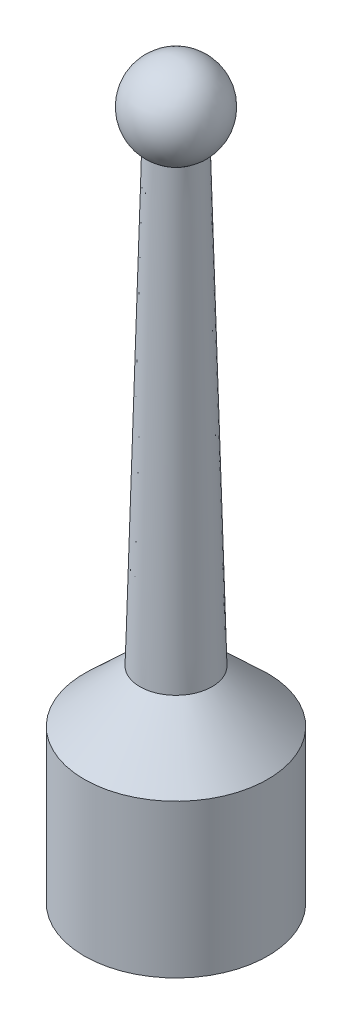
ISO-10303-21;
HEADER;
FILE_DESCRIPTION(('STEP AP214'),'2;1');
FILE_NAME('part.step','',(''),(''),'','','');
FILE_SCHEMA(('AUTOMOTIVE_DESIGN { 1 0 10303 214 1 1 1 1 }'));
ENDSEC;
DATA;
#1=APPLICATION_CONTEXT('core data for automotive mechanical design processes');
#2=APPLICATION_PROTOCOL_DEFINITION('international standard','automotive_design',2000,#1);
#3=PRODUCT_CONTEXT('',#1,'mechanical');
#4=PRODUCT('Part','Part','',(#3));
#5=PRODUCT_RELATED_PRODUCT_CATEGORY('part','',(#4));
#6=PRODUCT_DEFINITION_FORMATION('','',#4);
#7=PRODUCT_DEFINITION_CONTEXT('part definition',#1,'design');
#8=PRODUCT_DEFINITION('design','',#6,#7);
#9=PRODUCT_DEFINITION_SHAPE('','',#8);
#10=(LENGTH_UNIT() NAMED_UNIT(*) SI_UNIT(.MILLI.,.METRE.));
#11=(NAMED_UNIT(*) PLANE_ANGLE_UNIT() SI_UNIT($,.RADIAN.));
#12=(NAMED_UNIT(*) SI_UNIT($,.STERADIAN.) SOLID_ANGLE_UNIT());
#13=UNCERTAINTY_MEASURE_WITH_UNIT(LENGTH_MEASURE(1.E-05),#10,'distance_accuracy_value','');
#14=(GEOMETRIC_REPRESENTATION_CONTEXT(3) GLOBAL_UNCERTAINTY_ASSIGNED_CONTEXT((#13)) GLOBAL_UNIT_ASSIGNED_CONTEXT((#10,
#11,#12)) REPRESENTATION_CONTEXT('',''));
#15=CARTESIAN_POINT('',(0.,0.,0.));
#16=DIRECTION('',(0.,0.,1.));
#17=DIRECTION('',(1.,0.,0.));
#18=AXIS2_PLACEMENT_3D('',#15,#16,#17);
#19=CARTESIAN_POINT('',(0.,0.,0.));
#20=DIRECTION('',(0.,-1.,0.));
#21=DIRECTION('',(0.,0.,-1.));
#22=AXIS2_PLACEMENT_3D('',#19,#20,#21);
#23=PLANE('',#22);
#24=CARTESIAN_POINT('',(0.,0.,0.));
#25=DIRECTION('',(0.,-1.,0.));
#26=DIRECTION('',(0.,0.,-1.));
#27=AXIS2_PLACEMENT_3D('',#24,#25,#26);
#28=CIRCLE('',#27,7.4295);
#29=CARTESIAN_POINT('',(0.,0.,-7.4295));
#30=VERTEX_POINT('',#29);
#31=EDGE_CURVE('E10',#30,#30,#28,.T.);
#32=ORIENTED_EDGE('',*,*,#31,.T.);
#33=EDGE_LOOP('',(#32));
#34=FACE_BOUND('',#33,.T.);
#35=ADVANCED_FACE('F45',(#34),#23,.T.);
#36=CARTESIAN_POINT('',(0.,0.,0.));
#37=DIRECTION('',(0.,-1.,0.));
#38=DIRECTION('',(0.,0.,-1.));
#39=AXIS2_PLACEMENT_3D('',#36,#37,#38);
#40=CYLINDRICAL_SURFACE('',#39,7.4295);
#41=CARTESIAN_POINT('',(0.,12.3952,0.));
#42=DIRECTION('',(0.,-1.,0.));
#43=DIRECTION('',(0.,0.,-1.));
#44=AXIS2_PLACEMENT_3D('',#41,#42,#43);
#45=CIRCLE('',#44,7.4295);
#46=CARTESIAN_POINT('',(0.,12.3952,-7.4295));
#47=VERTEX_POINT('',#46);
#48=EDGE_CURVE('E52',#47,#47,#45,.T.);
#49=ORIENTED_EDGE('',*,*,#48,.T.);
#50=EDGE_LOOP('',(#49));
#51=FACE_BOUND('',#50,.T.);
#52=ORIENTED_EDGE('',*,*,#31,.F.);
#53=EDGE_LOOP('',(#52));
#54=FACE_BOUND('',#53,.T.);
#55=ADVANCED_FACE('F81',(#51,#54),#40,.T.);
#56=CARTESIAN_POINT('',(0.,12.3952,0.));
#57=DIRECTION('',(0.,-1.,0.));
#58=DIRECTION('',(0.,0.,-1.));
#59=AXIS2_PLACEMENT_3D('',#56,#57,#58);
#60=CONICAL_SURFACE('',#59,7.4295,0.81586768568369);
#61=CARTESIAN_POINT('',(0.,16.637,0.));
#62=DIRECTION('',(0.,-1.,0.));
#63=DIRECTION('',(0.,0.,-1.));
#64=AXIS2_PLACEMENT_3D('',#61,#62,#63);
#65=CIRCLE('',#64,2.921);
#66=CARTESIAN_POINT('',(0.,16.637,-2.921));
#67=VERTEX_POINT('',#66);
#68=EDGE_CURVE('E57',#67,#67,#65,.T.);
#69=ORIENTED_EDGE('',*,*,#68,.T.);
#70=EDGE_LOOP('',(#69));
#71=FACE_BOUND('',#70,.T.);
#72=ORIENTED_EDGE('',*,*,#48,.F.);
#73=EDGE_LOOP('',(#72));
#74=FACE_BOUND('',#73,.T.);
#75=ADVANCED_FACE('F78',(#71,#74),#60,.T.);
#76=CARTESIAN_POINT('',(0.,16.637,0.));
#77=DIRECTION('',(0.,-1.,0.));
#78=DIRECTION('',(0.,0.,-1.));
#79=AXIS2_PLACEMENT_3D('',#76,#77,#78);
#80=CONICAL_SURFACE('',#79,2.921,0.0261989484130161);
#81=CARTESIAN_POINT('',(0.,52.9851025196038,0.));
#82=DIRECTION('',(0.,-1.,0.));
#83=DIRECTION('',(0.,0.,-1.));
#84=AXIS2_PLACEMENT_3D('',#81,#82,#83);
#85=CIRCLE('',#84,1.9685);
#86=CARTESIAN_POINT('',(0.,52.9851025196038,-1.9685));
#87=VERTEX_POINT('',#86);
#88=EDGE_CURVE('E62',#87,#87,#85,.T.);
#89=ORIENTED_EDGE('',*,*,#88,.T.);
#90=EDGE_LOOP('',(#89));
#91=FACE_BOUND('',#90,.T.);
#92=ORIENTED_EDGE('',*,*,#68,.F.);
#93=EDGE_LOOP('',(#92));
#94=FACE_BOUND('',#93,.T.);
#95=ADVANCED_FACE('F69',(#91,#94),#80,.T.);
#96=CARTESIAN_POINT('',(0.,55.8546,0.));
#97=DIRECTION('',(0.,-1.,0.));
#98=DIRECTION('',(1.,0.,0.));
#99=AXIS2_PLACEMENT_3D('',#96,#97,#98);
#100=SPHERICAL_SURFACE('',#99,3.4798);
#101=ORIENTED_EDGE('',*,*,#88,.F.);
#102=EDGE_LOOP('',(#101));
#103=FACE_BOUND('',#102,.T.);
#104=ADVANCED_FACE('F72',(#103),#100,.T.);
#105=CLOSED_SHELL('',(#35,#55,#75,#95,#104));
#106=MANIFOLD_SOLID_BREP('B2',#105);
#107=ADVANCED_BREP_SHAPE_REPRESENTATION('',(#18,#106),#14);
#108=SHAPE_DEFINITION_REPRESENTATION(#9,#107);
ENDSEC;
END-ISO-10303-21;
